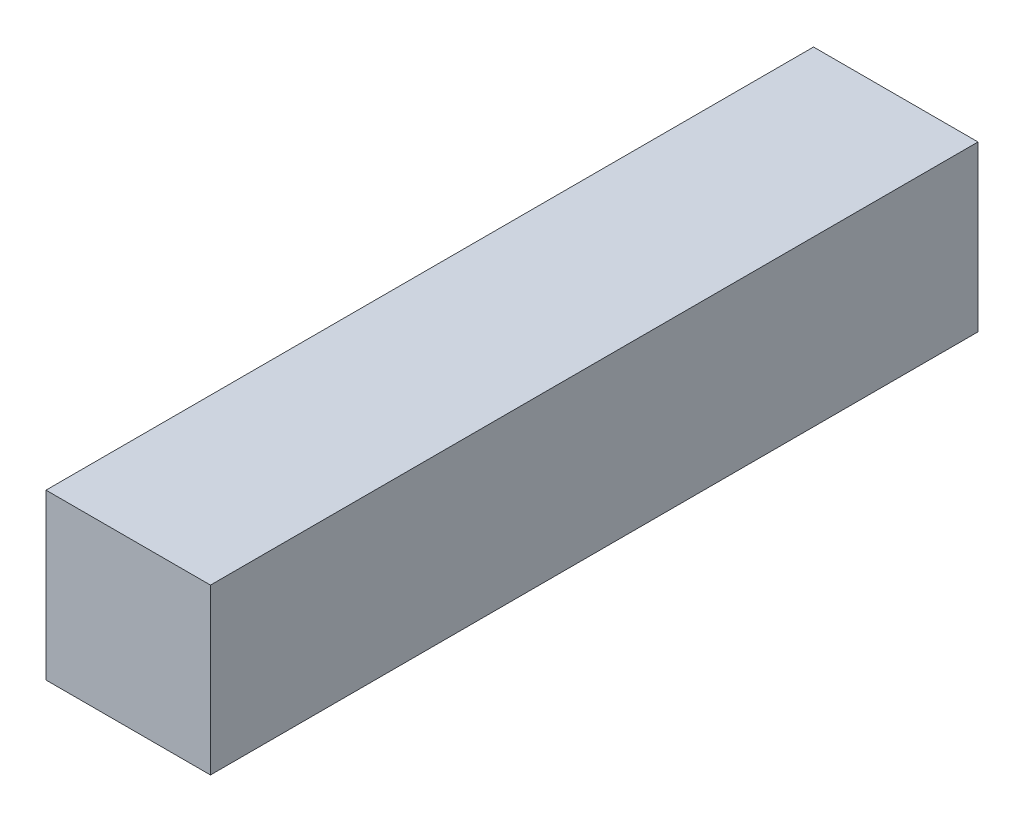
ISO-10303-21;
HEADER;
FILE_DESCRIPTION(('STEP AP214'),'2;1');
FILE_NAME('part.step','',(''),(''),'','','');
FILE_SCHEMA(('AUTOMOTIVE_DESIGN { 1 0 10303 214 1 1 1 1 }'));
ENDSEC;
DATA;
#1=APPLICATION_CONTEXT('core data for automotive mechanical design processes');
#2=APPLICATION_PROTOCOL_DEFINITION('international standard','automotive_design',2000,#1);
#3=PRODUCT_CONTEXT('',#1,'mechanical');
#4=PRODUCT('Part','Part','',(#3));
#5=PRODUCT_RELATED_PRODUCT_CATEGORY('part','',(#4));
#6=PRODUCT_DEFINITION_FORMATION('','',#4);
#7=PRODUCT_DEFINITION_CONTEXT('part definition',#1,'design');
#8=PRODUCT_DEFINITION('design','',#6,#7);
#9=PRODUCT_DEFINITION_SHAPE('','',#8);
#10=(LENGTH_UNIT() NAMED_UNIT(*) SI_UNIT(.MILLI.,.METRE.));
#11=(NAMED_UNIT(*) PLANE_ANGLE_UNIT() SI_UNIT($,.RADIAN.));
#12=(NAMED_UNIT(*) SI_UNIT($,.STERADIAN.) SOLID_ANGLE_UNIT());
#13=UNCERTAINTY_MEASURE_WITH_UNIT(LENGTH_MEASURE(1.E-05),#10,'distance_accuracy_value','');
#14=(GEOMETRIC_REPRESENTATION_CONTEXT(3) GLOBAL_UNCERTAINTY_ASSIGNED_CONTEXT((#13)) GLOBAL_UNIT_ASSIGNED_CONTEXT((#10,
#11,#12)) REPRESENTATION_CONTEXT('',''));
#15=CARTESIAN_POINT('',(0.,0.,0.));
#16=DIRECTION('',(0.,0.,1.));
#17=DIRECTION('',(1.,0.,0.));
#18=AXIS2_PLACEMENT_3D('',#15,#16,#17);
#19=CARTESIAN_POINT('',(1.5,-1.5,14.));
#20=DIRECTION('',(-1.,0.,0.));
#21=DIRECTION('',(0.,0.,1.));
#22=AXIS2_PLACEMENT_3D('',#19,#20,#21);
#23=PLANE('',#22);
#24=DIRECTION('',(0.,1.,0.));
#25=VECTOR('',#24,1.);
#26=CARTESIAN_POINT('',(1.5,-1.5,0.));
#27=LINE('',#26,#25);
#28=CARTESIAN_POINT('',(1.5,-1.5,0.));
#29=VERTEX_POINT('',#28);
#30=CARTESIAN_POINT('',(1.5,1.5,0.));
#31=VERTEX_POINT('',#30);
#32=EDGE_CURVE('E102',#29,#31,#27,.T.);
#33=ORIENTED_EDGE('',*,*,#32,.T.);
#34=DIRECTION('',(0.,0.,-1.));
#35=VECTOR('',#34,1.);
#36=CARTESIAN_POINT('',(1.5,1.5,14.));
#37=LINE('',#36,#35);
#38=CARTESIAN_POINT('',(1.5,1.5,14.));
#39=VERTEX_POINT('',#38);
#40=EDGE_CURVE('E11',#39,#31,#37,.T.);
#41=ORIENTED_EDGE('',*,*,#40,.F.);
#42=DIRECTION('',(0.,1.,0.));
#43=VECTOR('',#42,1.);
#44=CARTESIAN_POINT('',(1.5,-1.5,14.));
#45=LINE('',#44,#43);
#46=CARTESIAN_POINT('',(1.5,-1.5,14.));
#47=VERTEX_POINT('',#46);
#48=EDGE_CURVE('E90',#47,#39,#45,.T.);
#49=ORIENTED_EDGE('',*,*,#48,.F.);
#50=DIRECTION('',(0.,0.,-1.));
#51=VECTOR('',#50,1.);
#52=CARTESIAN_POINT('',(1.5,-1.5,14.));
#53=LINE('',#52,#51);
#54=EDGE_CURVE('E98',#47,#29,#53,.T.);
#55=ORIENTED_EDGE('',*,*,#54,.T.);
#56=EDGE_LOOP('',(#33,#41,#49,#55));
#57=FACE_BOUND('',#56,.T.);
#58=ADVANCED_FACE('F39',(#57),#23,.F.);
#59=CARTESIAN_POINT('',(-1.5,1.5,14.));
#60=DIRECTION('',(0.,-1.,0.));
#61=DIRECTION('',(0.,0.,-1.));
#62=AXIS2_PLACEMENT_3D('',#59,#60,#61);
#63=PLANE('',#62);
#64=DIRECTION('',(-1.,0.,0.));
#65=VECTOR('',#64,1.);
#66=CARTESIAN_POINT('',(-1.5,1.5,0.));
#67=LINE('',#66,#65);
#68=CARTESIAN_POINT('',(-1.5,1.5,0.));
#69=VERTEX_POINT('',#68);
#70=EDGE_CURVE('E94',#31,#69,#67,.T.);
#71=ORIENTED_EDGE('',*,*,#70,.T.);
#72=DIRECTION('',(0.,0.,-1.));
#73=VECTOR('',#72,1.);
#74=CARTESIAN_POINT('',(-1.5,1.5,14.));
#75=LINE('',#74,#73);
#76=CARTESIAN_POINT('',(-1.5,1.5,14.));
#77=VERTEX_POINT('',#76);
#78=EDGE_CURVE('E47',#77,#69,#75,.T.);
#79=ORIENTED_EDGE('',*,*,#78,.F.);
#80=DIRECTION('',(-1.,0.,0.));
#81=VECTOR('',#80,1.);
#82=CARTESIAN_POINT('',(-1.5,1.5,14.));
#83=LINE('',#82,#81);
#84=EDGE_CURVE('E85',#39,#77,#83,.T.);
#85=ORIENTED_EDGE('',*,*,#84,.F.);
#86=ORIENTED_EDGE('',*,*,#40,.T.);
#87=EDGE_LOOP('',(#71,#79,#85,#86));
#88=FACE_BOUND('',#87,.T.);
#89=ADVANCED_FACE('F93',(#88),#63,.F.);
#90=CARTESIAN_POINT('',(-1.5,-1.5,14.));
#91=DIRECTION('',(1.,0.,0.));
#92=DIRECTION('',(0.,0.,-1.));
#93=AXIS2_PLACEMENT_3D('',#90,#91,#92);
#94=PLANE('',#93);
#95=DIRECTION('',(0.,-1.,0.));
#96=VECTOR('',#95,1.);
#97=CARTESIAN_POINT('',(-1.5,-1.5,0.));
#98=LINE('',#97,#96);
#99=CARTESIAN_POINT('',(-1.5,-1.5,0.));
#100=VERTEX_POINT('',#99);
#101=EDGE_CURVE('E72',#69,#100,#98,.T.);
#102=ORIENTED_EDGE('',*,*,#101,.T.);
#103=DIRECTION('',(0.,0.,-1.));
#104=VECTOR('',#103,1.);
#105=CARTESIAN_POINT('',(-1.5,-1.5,14.));
#106=LINE('',#105,#104);
#107=CARTESIAN_POINT('',(-1.5,-1.5,14.));
#108=VERTEX_POINT('',#107);
#109=EDGE_CURVE('E95',#108,#100,#106,.T.);
#110=ORIENTED_EDGE('',*,*,#109,.F.);
#111=DIRECTION('',(0.,-1.,0.));
#112=VECTOR('',#111,1.);
#113=CARTESIAN_POINT('',(-1.5,-1.5,14.));
#114=LINE('',#113,#112);
#115=EDGE_CURVE('E88',#77,#108,#114,.T.);
#116=ORIENTED_EDGE('',*,*,#115,.F.);
#117=ORIENTED_EDGE('',*,*,#78,.T.);
#118=EDGE_LOOP('',(#102,#110,#116,#117));
#119=FACE_BOUND('',#118,.T.);
#120=ADVANCED_FACE('F96',(#119),#94,.F.);
#121=CARTESIAN_POINT('',(-1.5,-1.5,14.));
#122=DIRECTION('',(0.,1.,0.));
#123=DIRECTION('',(0.,0.,1.));
#124=AXIS2_PLACEMENT_3D('',#121,#122,#123);
#125=PLANE('',#124);
#126=DIRECTION('',(1.,0.,0.));
#127=VECTOR('',#126,1.);
#128=CARTESIAN_POINT('',(-1.5,-1.5,0.));
#129=LINE('',#128,#127);
#130=EDGE_CURVE('E78',#100,#29,#129,.T.);
#131=ORIENTED_EDGE('',*,*,#130,.T.);
#132=ORIENTED_EDGE('',*,*,#54,.F.);
#133=DIRECTION('',(1.,0.,0.));
#134=VECTOR('',#133,1.);
#135=CARTESIAN_POINT('',(-1.5,-1.5,14.));
#136=LINE('',#135,#134);
#137=EDGE_CURVE('E55',#108,#47,#136,.T.);
#138=ORIENTED_EDGE('',*,*,#137,.F.);
#139=ORIENTED_EDGE('',*,*,#109,.T.);
#140=EDGE_LOOP('',(#131,#132,#138,#139));
#141=FACE_BOUND('',#140,.T.);
#142=ADVANCED_FACE('F109',(#141),#125,.F.);
#143=CARTESIAN_POINT('',(0.,0.,14.));
#144=DIRECTION('',(0.,0.,-1.));
#145=DIRECTION('',(-1.,0.,0.));
#146=AXIS2_PLACEMENT_3D('',#143,#144,#145);
#147=PLANE('',#146);
#148=ORIENTED_EDGE('',*,*,#48,.T.);
#149=ORIENTED_EDGE('',*,*,#84,.T.);
#150=ORIENTED_EDGE('',*,*,#115,.T.);
#151=ORIENTED_EDGE('',*,*,#137,.T.);
#152=EDGE_LOOP('',(#148,#149,#150,#151));
#153=FACE_BOUND('',#152,.T.);
#154=ADVANCED_FACE('F86',(#153),#147,.F.);
#155=CARTESIAN_POINT('',(0.,0.,0.));
#156=DIRECTION('',(0.,0.,-1.));
#157=DIRECTION('',(-1.,0.,0.));
#158=AXIS2_PLACEMENT_3D('',#155,#156,#157);
#159=PLANE('',#158);
#160=ORIENTED_EDGE('',*,*,#32,.F.);
#161=ORIENTED_EDGE('',*,*,#130,.F.);
#162=ORIENTED_EDGE('',*,*,#101,.F.);
#163=ORIENTED_EDGE('',*,*,#70,.F.);
#164=EDGE_LOOP('',(#160,#161,#162,#163));
#165=FACE_BOUND('',#164,.T.);
#166=ADVANCED_FACE('F112',(#165),#159,.T.);
#167=CLOSED_SHELL('',(#58,#89,#120,#142,#154,#166));
#168=MANIFOLD_SOLID_BREP('B2',#167);
#169=ADVANCED_BREP_SHAPE_REPRESENTATION('',(#18,#168),#14);
#170=SHAPE_DEFINITION_REPRESENTATION(#9,#169);
ENDSEC;
END-ISO-10303-21;
